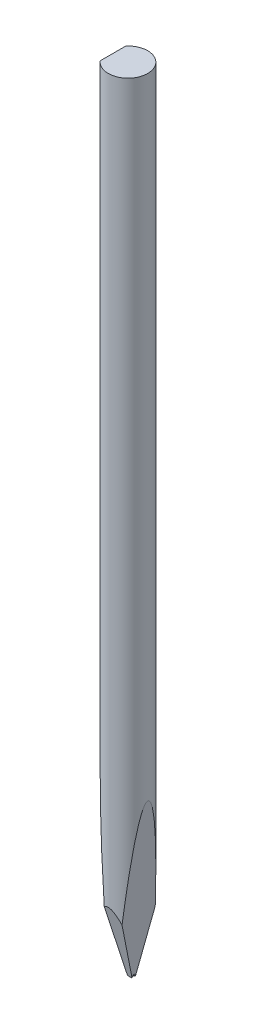
ISO-10303-21;
HEADER;
FILE_DESCRIPTION(('STEP AP214'),'2;1');
FILE_NAME('part.step','',(''),(''),'','','');
FILE_SCHEMA(('AUTOMOTIVE_DESIGN { 1 0 10303 214 1 1 1 1 }'));
ENDSEC;
DATA;
#1=APPLICATION_CONTEXT('core data for automotive mechanical design processes');
#2=APPLICATION_PROTOCOL_DEFINITION('international standard','automotive_design',2000,#1);
#3=PRODUCT_CONTEXT('',#1,'mechanical');
#4=PRODUCT('Part','Part','',(#3));
#5=PRODUCT_RELATED_PRODUCT_CATEGORY('part','',(#4));
#6=PRODUCT_DEFINITION_FORMATION('','',#4);
#7=PRODUCT_DEFINITION_CONTEXT('part definition',#1,'design');
#8=PRODUCT_DEFINITION('design','',#6,#7);
#9=PRODUCT_DEFINITION_SHAPE('','',#8);
#10=(LENGTH_UNIT() NAMED_UNIT(*) SI_UNIT(.MILLI.,.METRE.));
#11=(NAMED_UNIT(*) PLANE_ANGLE_UNIT() SI_UNIT($,.RADIAN.));
#12=(NAMED_UNIT(*) SI_UNIT($,.STERADIAN.) SOLID_ANGLE_UNIT());
#13=UNCERTAINTY_MEASURE_WITH_UNIT(LENGTH_MEASURE(1.E-05),#10,'distance_accuracy_value','');
#14=(GEOMETRIC_REPRESENTATION_CONTEXT(3) GLOBAL_UNCERTAINTY_ASSIGNED_CONTEXT((#13)) GLOBAL_UNIT_ASSIGNED_CONTEXT((#10,
#11,#12)) REPRESENTATION_CONTEXT('',''));
#15=CARTESIAN_POINT('',(0.,0.,0.));
#16=DIRECTION('',(0.,0.,1.));
#17=DIRECTION('',(1.,0.,0.));
#18=AXIS2_PLACEMENT_3D('',#15,#16,#17);
#19=CARTESIAN_POINT('',(-1.20777,0.0528579827698459,0.));
#20=DIRECTION('',(1.,0.,0.));
#21=DIRECTION('',(0.,0.,-1.));
#22=AXIS2_PLACEMENT_3D('',#19,#20,#21);
#23=CYLINDRICAL_SURFACE('',#22,0.02794);
#24=CARTESIAN_POINT('',(0.331594350892738,0.0528579827698459,0.));
#25=DIRECTION('',(-1.,0.,0.));
#26=DIRECTION('',(0.,1.,0.));
#27=AXIS2_PLACEMENT_3D('',#24,#25,#26);
#28=CIRCLE('',#27,0.0284220172301541);
#29=CARTESIAN_POINT('',(0.331594350892738,0.081038991384923,0.));
#30=VERTEX_POINT('',#29);
#31=CARTESIAN_POINT('',(0.331594350892738,0.0690219452640596,-0.023084530817166));
#32=VERTEX_POINT('',#31);
#33=EDGE_CURVE('E785',#30,#32,#28,.T.);
#34=ORIENTED_EDGE('',*,*,#33,.F.);
#35=CARTESIAN_POINT('',(0.331594350892738,0.0528579827698459,0.));
#36=DIRECTION('',(-1.,0.,0.));
#37=DIRECTION('',(0.,0.573576436351046,0.819152044288992));
#38=AXIS2_PLACEMENT_3D('',#35,#36,#37);
#39=CIRCLE('',#38,0.0284220172301541);
#40=CARTESIAN_POINT('',(0.331594350892738,0.0690219452640599,0.0230845308171661));
#41=VERTEX_POINT('',#40);
#42=EDGE_CURVE('E787',#41,#30,#39,.T.);
#43=ORIENTED_EDGE('',*,*,#42,.F.);
#44=CARTESIAN_POINT('',(0.141102121906106,0.0688837084014941,0.0228871081174345));
#45=DIRECTION('',(1.,0.,0.));
#46=VECTOR('',#45,1.);
#47=LINE('',#44,#46);
#48=CARTESIAN_POINT('',(0.141102121906106,0.0690219452640599,0.0230845308171661));
#49=VERTEX_POINT('',#48);
#50=EDGE_CURVE('E741',#49,#41,#47,.T.);
#51=ORIENTED_EDGE('',*,*,#50,.F.);
#52=CARTESIAN_POINT('',(0.141102121906106,0.0528579827698459,0.));
#53=DIRECTION('',(-1.,0.,0.));
#54=DIRECTION('',(0.,0.573576436351046,0.819152044288992));
#55=AXIS2_PLACEMENT_3D('',#52,#53,#54);
#56=CIRCLE('',#55,0.0284220172301541);
#57=CARTESIAN_POINT('',(0.141102121906106,0.081038991384923,0.));
#58=VERTEX_POINT('',#57);
#59=EDGE_CURVE('E819',#49,#58,#56,.T.);
#60=ORIENTED_EDGE('',*,*,#59,.T.);
#61=CARTESIAN_POINT('',(0.141102121906106,0.0528579827698459,0.));
#62=DIRECTION('',(-1.,0.,0.));
#63=DIRECTION('',(0.,1.,0.));
#64=AXIS2_PLACEMENT_3D('',#61,#62,#63);
#65=CIRCLE('',#64,0.028422017230154);
#66=CARTESIAN_POINT('',(0.141102121906106,0.0690219452640595,-0.023084530817166));
#67=VERTEX_POINT('',#66);
#68=EDGE_CURVE('E790',#58,#67,#65,.T.);
#69=ORIENTED_EDGE('',*,*,#68,.T.);
#70=CARTESIAN_POINT('',(0.141102121906106,0.0688837084014941,-0.0228871081174345));
#71=DIRECTION('',(1.,0.,0.));
#72=VECTOR('',#71,1.);
#73=LINE('',#70,#72);
#74=EDGE_CURVE('E559',#67,#32,#73,.T.);
#75=ORIENTED_EDGE('',*,*,#74,.T.);
#76=EDGE_LOOP('',(#34,#43,#51,#60,#69,#75));
#77=FACE_BOUND('',#76,.T.);
#78=ADVANCED_FACE('F409',(#77),#23,.F.);
#79=CARTESIAN_POINT('',(0.,0.,0.));
#80=DIRECTION('',(0.,1.,0.));
#81=DIRECTION('',(0.,0.,1.));
#82=AXIS2_PLACEMENT_3D('',#79,#80,#81);
#83=PLANE('',#82);
#84=CARTESIAN_POINT('',(0.141102121906106,0.,-0.14922762077227));
#85=DIRECTION('',(0.,1.,0.));
#86=DIRECTION('',(0.,0.,-1.));
#87=AXIS2_PLACEMENT_3D('',#84,#85,#86);
#88=ELLIPSE('',#87,0.0775191863863524,0.0635);
#89=CARTESIAN_POINT('',(0.0952500000000003,0.,-0.0955991595905925));
#90=VERTEX_POINT('',#89);
#91=CARTESIAN_POINT('',(0.141102121906106,-0.000241008615077043,-0.071582973242009));
#92=VERTEX_POINT('',#91);
#93=EDGE_CURVE('E891',#90,#92,#88,.T.);
#94=ORIENTED_EDGE('',*,*,#93,.F.);
#95=DIRECTION('',(0.,0.,-1.));
#96=VECTOR('',#95,1.);
#97=CARTESIAN_POINT('',(0.0952500000000003,0.,80.8360855398669));
#98=LINE('',#97,#96);
#99=CARTESIAN_POINT('',(0.0952500000000045,0.,-0.133349999999995));
#100=VERTEX_POINT('',#99);
#101=EDGE_CURVE('E707',#90,#100,#98,.T.);
#102=ORIENTED_EDGE('',*,*,#101,.T.);
#103=DIRECTION('',(-1.,0.,0.));
#104=VECTOR('',#103,1.);
#105=CARTESIAN_POINT('',(81.0604131023871,0.,-0.13335));
#106=LINE('',#105,#104);
#107=CARTESIAN_POINT('',(0.444911998918038,0.,-0.13335));
#108=VERTEX_POINT('',#107);
#109=EDGE_CURVE('E551',#108,#100,#106,.T.);
#110=ORIENTED_EDGE('',*,*,#109,.F.);
#111=CARTESIAN_POINT('',(0.331594350892738,0.,-0.257754481713163));
#112=DIRECTION('',(0.,1.,0.));
#113=DIRECTION('',(0.,0.,-1.));
#114=AXIS2_PLACEMENT_3D('',#111,#112,#113);
#115=ELLIPSE('',#114,0.186046047327246,0.1524);
#116=CARTESIAN_POINT('',(0.331594350892738,-0.000241008615077052,-0.071582973242009));
#117=VERTEX_POINT('',#116);
#118=EDGE_CURVE('E531',#117,#108,#115,.T.);
#119=ORIENTED_EDGE('',*,*,#118,.F.);
#120=CARTESIAN_POINT('',(0.141102121906106,0.,-0.07112));
#121=DIRECTION('',(1.,0.,0.));
#122=VECTOR('',#121,1.);
#123=LINE('',#120,#122);
#124=EDGE_CURVE('E548',#92,#117,#123,.T.);
#125=ORIENTED_EDGE('',*,*,#124,.F.);
#126=EDGE_LOOP('',(#94,#102,#110,#119,#125));
#127=FACE_BOUND('',#126,.T.);
#128=ADVANCED_FACE('F547',(#127),#83,.F.);
#129=CARTESIAN_POINT('',(0.141102121906106,0.,0.14922762077227));
#130=DIRECTION('',(0.,1.,0.));
#131=DIRECTION('',(0.,0.,-1.));
#132=AXIS2_PLACEMENT_3D('',#129,#130,#131);
#133=ELLIPSE('',#132,0.0775191863863523,0.0635);
#134=CARTESIAN_POINT('',(0.141102121906108,-0.0002410086150768,0.0715829732420075));
#135=VERTEX_POINT('',#134);
#136=CARTESIAN_POINT('',(0.0952500000000003,0.,0.0955991595906203));
#137=VERTEX_POINT('',#136);
#138=EDGE_CURVE('E892',#135,#137,#133,.T.);
#139=ORIENTED_EDGE('',*,*,#138,.F.);
#140=CARTESIAN_POINT('',(0.141102121906111,0.,0.071119999999997));
#141=DIRECTION('',(1.,0.,0.));
#142=VECTOR('',#141,1.);
#143=LINE('',#140,#142);
#144=CARTESIAN_POINT('',(0.331594350892738,-0.000241008615076803,0.0715829732420075));
#145=VERTEX_POINT('',#144);
#146=EDGE_CURVE('E560',#135,#145,#143,.T.);
#147=ORIENTED_EDGE('',*,*,#146,.T.);
#148=CARTESIAN_POINT('',(0.331594350892738,0.,0.257754481713163));
#149=DIRECTION('',(0.,1.,0.));
#150=DIRECTION('',(0.,0.,-1.));
#151=AXIS2_PLACEMENT_3D('',#148,#149,#150);
#152=ELLIPSE('',#151,0.186046047327246,0.1524);
#153=CARTESIAN_POINT('',(0.444911998918038,0.,0.13335));
#154=VERTEX_POINT('',#153);
#155=EDGE_CURVE('E893',#154,#145,#152,.T.);
#156=ORIENTED_EDGE('',*,*,#155,.F.);
#157=DIRECTION('',(-1.,0.,0.));
#158=VECTOR('',#157,1.);
#159=CARTESIAN_POINT('',(81.0604131023871,0.,0.13335));
#160=LINE('',#159,#158);
#161=CARTESIAN_POINT('',(0.0952500000000043,0.,0.133350000000003));
#162=VERTEX_POINT('',#161);
#163=EDGE_CURVE('E906',#154,#162,#160,.T.);
#164=ORIENTED_EDGE('',*,*,#163,.T.);
#165=EDGE_CURVE('E710',#162,#137,#98,.T.);
#166=ORIENTED_EDGE('',*,*,#165,.T.);
#167=EDGE_LOOP('',(#139,#147,#156,#164,#166));
#168=FACE_BOUND('',#167,.T.);
#169=ADVANCED_FACE('F763',(#168),#83,.F.);
#170=CARTESIAN_POINT('',(81.0604131023871,0.,0.13335));
#171=DIRECTION('',(0.,-0.258819045102522,0.965925826289068));
#172=DIRECTION('',(0.,-0.965925826289068,-0.258819045102522));
#173=AXIS2_PLACEMENT_3D('',#170,#171,#172);
#174=PLANE('',#173);
#175=ORIENTED_EDGE('',*,*,#163,.F.);
#176=CARTESIAN_POINT('',(0.331594350892738,0.128496221506221,0.167780458783043));
#177=DIRECTION('',(0.,-0.258819045102522,0.965925826289068));
#178=DIRECTION('',(0.,0.965925826289068,0.258819045102522));
#179=AXIS2_PLACEMENT_3D('',#176,#177,#178);
#180=ELLIPSE('',#179,0.198944070894239,0.1524);
#181=CARTESIAN_POINT('',(0.467097739269662,0.040550845408876,0.144215566279708));
#182=VERTEX_POINT('',#181);
#183=EDGE_CURVE('E552',#154,#182,#180,.T.);
#184=ORIENTED_EDGE('',*,*,#183,.T.);
#185=DIRECTION('',(0.0842074097641779,0.962495097884607,0.257899784197096));
#186=VECTOR('',#185,1.);
#187=CARTESIAN_POINT('',(1.03505331806168,6.53231281664674,1.88367794392797));
#188=LINE('',#187,#186);
#189=CARTESIAN_POINT('',(0.856037795649059,4.48615603246423,1.3354118860188));
#190=VERTEX_POINT('',#189);
#191=EDGE_CURVE('E903',#182,#190,#188,.T.);
#192=ORIENTED_EDGE('',*,*,#191,.T.);
#193=CARTESIAN_POINT('',(0.,-0.497668975189311,0.));
#194=DIRECTION('',(0.,-0.258819045102522,0.965925826289068));
#195=DIRECTION('',(0.,-0.965925826289068,-0.258819045102522));
#196=AXIS2_PLACEMENT_3D('',#193,#194,#195);
#197=ELLIPSE('',#196,6.12872209373802,1.58623);
#198=CARTESIAN_POINT('',(-0.365218019910243,5.26317355132302,1.54361310270185));
#199=VERTEX_POINT('',#198);
#200=EDGE_CURVE('E920',#190,#199,#197,.T.);
#201=ORIENTED_EDGE('',*,*,#200,.T.);
#202=DIRECTION('',(0.0842074097641778,-0.962495097884607,-0.257899784197096));
#203=VECTOR('',#202,1.);
#204=CARTESIAN_POINT('',(0.669364892060237,-6.56216324404258,-1.62497634184241));
#205=LINE('',#204,#203);
#206=EDGE_CURVE('E915',#199,#162,#205,.T.);
#207=ORIENTED_EDGE('',*,*,#206,.T.);
#208=EDGE_LOOP('',(#175,#184,#192,#201,#207));
#209=FACE_BOUND('',#208,.T.);
#210=ADVANCED_FACE('F773',(#209),#174,.T.);
#211=CARTESIAN_POINT('',(81.0604131023871,0.,-0.13335));
#212=DIRECTION('',(0.,-0.258819045102522,-0.965925826289068));
#213=DIRECTION('',(0.,0.965925826289068,-0.258819045102522));
#214=AXIS2_PLACEMENT_3D('',#211,#212,#213);
#215=PLANE('',#214);
#216=DIRECTION('',(-0.0842074097641779,-0.962495097884607,0.257899784197096));
#217=VECTOR('',#216,1.);
#218=CARTESIAN_POINT('',(1.03505331806168,6.53231281664674,-1.88367794392797));
#219=LINE('',#218,#217);
#220=CARTESIAN_POINT('',(0.856037795649053,4.48615603246424,-1.33541188601881));
#221=VERTEX_POINT('',#220);
#222=CARTESIAN_POINT('',(0.467097739269663,0.0405508454088778,-0.144215566279708));
#223=VERTEX_POINT('',#222);
#224=EDGE_CURVE('E573',#221,#223,#219,.T.);
#225=ORIENTED_EDGE('',*,*,#224,.T.);
#226=CARTESIAN_POINT('',(0.331594350892738,0.128496221506221,-0.167780458783043));
#227=DIRECTION('',(0.,-0.258819045102522,-0.965925826289068));
#228=DIRECTION('',(0.,-0.965925826289068,0.258819045102522));
#229=AXIS2_PLACEMENT_3D('',#226,#227,#228);
#230=ELLIPSE('',#229,0.198944070894239,0.1524);
#231=EDGE_CURVE('E553',#223,#108,#230,.T.);
#232=ORIENTED_EDGE('',*,*,#231,.T.);
#233=ORIENTED_EDGE('',*,*,#109,.T.);
#234=DIRECTION('',(-0.0842074097641778,0.962495097884607,-0.257899784197096));
#235=VECTOR('',#234,1.);
#236=CARTESIAN_POINT('',(0.669364892060237,-6.56216324404258,1.62497634184241));
#237=LINE('',#236,#235);
#238=CARTESIAN_POINT('',(-0.365218019910235,5.26317355132303,-1.54361310270185));
#239=VERTEX_POINT('',#238);
#240=EDGE_CURVE('E890',#100,#239,#237,.T.);
#241=ORIENTED_EDGE('',*,*,#240,.T.);
#242=CARTESIAN_POINT('',(0.,-0.497668975189311,0.));
#243=DIRECTION('',(0.,-0.258819045102522,-0.965925826289068));
#244=DIRECTION('',(0.,-0.965925826289068,0.258819045102522));
#245=AXIS2_PLACEMENT_3D('',#242,#243,#244);
#246=ELLIPSE('',#245,6.12872209373802,1.58623);
#247=EDGE_CURVE('E922',#239,#221,#246,.T.);
#248=ORIENTED_EDGE('',*,*,#247,.T.);
#249=EDGE_LOOP('',(#225,#232,#233,#241,#248));
#250=FACE_BOUND('',#249,.T.);
#251=ADVANCED_FACE('F695',(#250),#215,.T.);
#252=CARTESIAN_POINT('',(0.0952500000000003,0.,80.8360855398669));
#253=DIRECTION('',(-0.996194698091745,-0.0871557427476583,0.));
#254=DIRECTION('',(0.0871557427476583,-0.996194698091746,0.));
#255=AXIS2_PLACEMENT_3D('',#252,#253,#254);
#256=PLANE('',#255);
#257=CARTESIAN_POINT('',(0.0853680982809139,0.112950653499904,-0.0130450000003961));
#258=CARTESIAN_POINT('',(0.085306802730967,0.113651264841724,-0.010357214784414));
#259=CARTESIAN_POINT('',(0.085264709906803,0.11413238802349,-0.00761252451787182));
#260=CARTESIAN_POINT('',(0.0852193471342383,0.114650886886502,-0.00208345316103922));
#261=CARTESIAN_POINT('',(0.0852160452819909,0.114688627230386,0.000700893426169584));
#262=CARTESIAN_POINT('',(0.0852493428569628,0.114308034206902,0.00636973147461618));
#263=CARTESIAN_POINT('',(0.0852878213215511,0.113868223344128,0.00925279363342999));
#264=CARTESIAN_POINT('',(0.0854061785101584,0.112515394487938,0.0149040524136027));
#265=CARTESIAN_POINT('',(0.085486054899822,0.111602403176328,0.0176722555021557));
#266=CARTESIAN_POINT('',(0.0856849895254451,0.109328570000625,0.0230348742293253));
#267=CARTESIAN_POINT('',(0.0858042672858596,0.107965218960532,0.0256282158665421));
#268=CARTESIAN_POINT('',(0.0860779870815729,0.104836587379228,0.0305581940887367));
#269=CARTESIAN_POINT('',(0.0862324397587098,0.103071185201251,0.0328947526686122));
#270=CARTESIAN_POINT('',(0.0865771749828692,0.0991308435585054,0.0373231271246905));
#271=CARTESIAN_POINT('',(0.0867684271174483,0.0969448216572513,0.0394050019926743));
#272=CARTESIAN_POINT('',(0.0871777649309649,0.0922660690392582,0.043186065462563));
#273=CARTESIAN_POINT('',(0.0873958540875975,0.0897732985722824,0.0448852043864293));
#274=CARTESIAN_POINT('',(0.0878610195252131,0.0844564332909002,0.0479145163021059));
#275=CARTESIAN_POINT('',(0.0881088505893304,0.0816237112657902,0.0492294283580893));
#276=CARTESIAN_POINT('',(0.0886199597072271,0.0757817073158118,0.0513740814121499));
#277=CARTESIAN_POINT('',(0.0888832341259697,0.0727724669396057,0.0522039360821871));
#278=CARTESIAN_POINT('',(0.0893465110871542,0.0674771870426021,0.0532035136177015));
#279=CARTESIAN_POINT('',(0.0895446576930745,0.065212360973319,0.0534902786271572));
#280=CARTESIAN_POINT('',(0.0899422533359651,0.0606678219797293,0.053788144086283));
#281=CARTESIAN_POINT('',(0.0901417003062279,0.0583881326779973,0.0537996082519708));
#282=CARTESIAN_POINT('',(0.0903405577126821,0.0561151821214351,0.0536720792167106));
#283=B_SPLINE_CURVE_WITH_KNOTS('',3,(#257,#258,#259,#260,#261,#262,#263,#264,#265,#266,#267,
#268,#269,#270,#271,#272,#273,#274,#275,#276,#277,#278,#279,#280,#281,#282),.UNSPECIFIED.,.F.,
.F.,(4,2,2,2,2,2,2,2,2,2,2,2,4),(0.,0.00832479897356052,0.0166427506909291,0.025350898033152,
0.034058554391816,0.0428155675386442,0.0515752335647377,0.0606088857611473,0.0696437098251714,
0.078999663239234,0.0883534232295314,0.0952120350022421,0.102061584963279),.UNSPECIFIED.);
#284=CARTESIAN_POINT('',(0.0852221219067103,0.114619171092019,5.48915438786733E-13));
#285=VERTEX_POINT('',#284);
#286=CARTESIAN_POINT('',(0.0877399893223402,0.0858398148400881,0.0471029377298195));
#287=VERTEX_POINT('',#286);
#288=EDGE_CURVE('E419',#285,#287,#283,.T.);
#289=ORIENTED_EDGE('',*,*,#288,.T.);
#290=CARTESIAN_POINT('',(0.141102121906106,-0.524092151579379,0.516200896024695));
#291=DIRECTION('',(-0.996194698091745,-0.0871557427476583,0.));
#292=DIRECTION('',(-0.0713040831581058,0.815009399897592,-0.575043829463067));
#293=AXIS2_PLACEMENT_3D('',#290,#291,#292);
#294=ELLIPSE('',#293,0.88943291563464,0.0635);
#295=EDGE_CURVE('E49',#287,#137,#294,.T.);
#296=ORIENTED_EDGE('',*,*,#295,.T.);
#297=ORIENTED_EDGE('',*,*,#165,.F.);
#298=ORIENTED_EDGE('',*,*,#206,.F.);
#299=CARTESIAN_POINT('',(0.,1.08871248183801,0.));
#300=DIRECTION('',(-0.996194698091745,-0.0871557427476583,0.));
#301=DIRECTION('',(0.0871557427476583,-0.996194698091746,0.));
#302=AXIS2_PLACEMENT_3D('',#299,#300,#301);
#303=ELLIPSE('',#302,18.1999481616789,1.58623);
#304=CARTESIAN_POINT('',(-1.20777,14.8935867515441,1.02830794998386));
#305=VERTEX_POINT('',#304);
#306=EDGE_CURVE('E941',#199,#305,#303,.T.);
#307=ORIENTED_EDGE('',*,*,#306,.T.);
#308=DIRECTION('',(0.,0.,1.));
#309=VECTOR('',#308,1.);
#310=CARTESIAN_POINT('',(-1.20777,14.8935867515441,1.59623));
#311=LINE('',#310,#309);
#312=CARTESIAN_POINT('',(-1.20777,14.8935867515441,-1.02830794998386));
#313=VERTEX_POINT('',#312);
#314=EDGE_CURVE('E943',#313,#305,#311,.T.);
#315=ORIENTED_EDGE('',*,*,#314,.F.);
#316=EDGE_CURVE('E716',#313,#239,#303,.T.);
#317=ORIENTED_EDGE('',*,*,#316,.T.);
#318=ORIENTED_EDGE('',*,*,#240,.F.);
#319=ORIENTED_EDGE('',*,*,#101,.F.);
#320=CARTESIAN_POINT('',(0.141102121906106,-0.524092151579379,-0.516200896024695));
#321=DIRECTION('',(-0.996194698091745,-0.0871557427476583,0.));
#322=DIRECTION('',(0.0713040831581058,-0.815009399897592,-0.575043829463068));
#323=AXIS2_PLACEMENT_3D('',#320,#321,#322);
#324=ELLIPSE('',#323,0.88943291563464,0.0635);
#325=CARTESIAN_POINT('',(0.0877399893223272,0.0858398148400996,-0.0471029377298361));
#326=VERTEX_POINT('',#325);
#327=EDGE_CURVE('E689',#90,#326,#324,.T.);
#328=ORIENTED_EDGE('',*,*,#327,.T.);
#329=CARTESIAN_POINT('',(0.0903405577130435,0.0561151821173046,-0.0536720792164797));
#330=CARTESIAN_POINT('',(0.0900625588999809,0.0592927230907149,-0.053852072228692));
#331=CARTESIAN_POINT('',(0.0897833101699781,0.0624845506801266,-0.0537576509357613));
#332=CARTESIAN_POINT('',(0.0892301888232625,0.0688067566028605,-0.0530350641523713));
#333=CARTESIAN_POINT('',(0.0889563144881266,0.0719371545778478,-0.0524070722088197));
#334=CARTESIAN_POINT('',(0.0884214545400756,0.078050631758722,-0.0506319537506382));
#335=CARTESIAN_POINT('',(0.0881604773546435,0.0810336146380393,-0.0494844926430063));
#336=CARTESIAN_POINT('',(0.0876591696698671,0.0867635876948096,-0.0467011384868344));
#337=CARTESIAN_POINT('',(0.0874188344639484,0.0895106316686553,-0.0450653571628562));
#338=CARTESIAN_POINT('',(0.0869671653231595,0.0946732335714155,-0.0413568566453099));
#339=CARTESIAN_POINT('',(0.0867556864515055,0.0970904481353496,-0.0392864645348245));
#340=CARTESIAN_POINT('',(0.0863669840227873,0.101533337225809,-0.0347575738077288));
#341=CARTESIAN_POINT('',(0.086189760798802,0.103559007945224,-0.0322990714178172));
#342=CARTESIAN_POINT('',(0.0858798890254995,0.107100858521221,-0.0271313679753356));
#343=CARTESIAN_POINT('',(0.0857461907782302,0.108629036480298,-0.0244304604692065));
#344=CARTESIAN_POINT('',(0.0855219861385629,0.111191707238216,-0.0188017469580206));
#345=CARTESIAN_POINT('',(0.0854314719174977,0.112226289519136,-0.015873982191004));
#346=CARTESIAN_POINT('',(0.0852996580270156,0.113732929181576,-0.00999220773693177));
#347=CARTESIAN_POINT('',(0.0852566592818415,0.114224407087869,-0.00704318894919974));
#348=CARTESIAN_POINT('',(0.085215688465718,0.114692705659048,-0.00110548969918523));
#349=CARTESIAN_POINT('',(0.0852176685475672,0.114670073219947,0.00188314523728298));
#350=CARTESIAN_POINT('',(0.0852533777820124,0.114261914802548,0.00622930478701443));
#351=CARTESIAN_POINT('',(0.0852696472766882,0.114075953627463,0.00760832458486332));
#352=CARTESIAN_POINT('',(0.08531175543705,0.113594655152155,0.0103443328597831));
#353=CARTESIAN_POINT('',(0.08533757607586,0.113299523900066,0.0117013578455679));
#354=CARTESIAN_POINT('',(0.0853680982809139,0.112950653499904,0.0130450000003961));
#355=B_SPLINE_CURVE_WITH_KNOTS('',3,(#329,#330,#331,#332,#333,#334,#335,#336,#337,#338,#339,
#340,#341,#342,#343,#344,#345,#346,#347,#348,#349,#350,#351,#352,#353,#354),.UNSPECIFIED.,.F.,
.F.,(4,2,2,2,2,2,2,2,2,2,2,2,4),(0.,0.0095713661754159,0.0191396204004347,0.0287140463795143,
0.0382862834674833,0.0478085177422229,0.057330844600115,0.0666027430295172,0.0758729599525209,
0.0847997315385886,0.0937170075231793,0.0978879902754805,0.102051140531945),.UNSPECIFIED.);
#356=EDGE_CURVE('E699',#326,#285,#355,.T.);
#357=ORIENTED_EDGE('',*,*,#356,.T.);
#358=EDGE_LOOP('',(#289,#296,#297,#298,#307,#315,#317,#318,#319,#328,#357));
#359=FACE_BOUND('',#358,.T.);
#360=ADVANCED_FACE('F692',(#359),#256,.T.);
#361=CARTESIAN_POINT('',(0.46355,0.,80.8360855398669));
#362=DIRECTION('',(0.996194698091745,-0.0871557427476584,0.));
#363=DIRECTION('',(0.0871557427476584,0.996194698091746,0.));
#364=AXIS2_PLACEMENT_3D('',#361,#362,#363);
#365=PLANE('',#364);
#366=CARTESIAN_POINT('',(0.483994350892738,0.23368,1.72835566035269E-11));
#367=VERTEX_POINT('',#366);
#368=VERTEX_LOOP('',#367);
#369=FACE_BOUND('',#368,.T.);
#370=ORIENTED_EDGE('',*,*,#191,.F.);
#371=CARTESIAN_POINT('',(0.331594350892738,-1.50825997094083,1.31384948294588));
#372=DIRECTION('',(0.996194698091745,-0.0871557427476584,0.));
#373=DIRECTION('',(0.0713040831581058,0.815009399897592,-0.575043829463067));
#374=AXIS2_PLACEMENT_3D('',#371,#372,#373);
#375=ELLIPSE('',#374,2.13463899752313,0.1524);
#376=CARTESIAN_POINT('',(0.474605606715804,0.126366163000392,0.104980561075495));
#377=VERTEX_POINT('',#376);
#378=EDGE_CURVE('E706',#182,#377,#375,.T.);
#379=ORIENTED_EDGE('',*,*,#378,.T.);
#380=CARTESIAN_POINT('',(0.469123918687252,0.0637101821266247,0.114648463830072));
#381=CARTESIAN_POINT('',(0.469769903952762,0.0710938274982212,0.115313604623831));
#382=CARTESIAN_POINT('',(0.470420209169954,0.0785268501434823,0.115330309599867));
#383=CARTESIAN_POINT('',(0.471710717548722,0.0932774284099497,0.114127188446851));
#384=CARTESIAN_POINT('',(0.472350939964625,0.100595204109123,0.112910112945749));
#385=CARTESIAN_POINT('',(0.47361042117263,0.114991140190969,0.10928824564559));
#386=CARTESIAN_POINT('',(0.474229479487037,0.122067009103099,0.10687433894372));
#387=CARTESIAN_POINT('',(0.475426290961142,0.135746626848661,0.100943323233606));
#388=CARTESIAN_POINT('',(0.476004023570742,0.142350140793403,0.0974256699827568));
#389=CARTESIAN_POINT('',(0.47713073766355,0.155228541804454,0.0891940215700963));
#390=CARTESIAN_POINT('',(0.477676952219606,0.1614718027487,0.0844301420514504));
#391=CARTESIAN_POINT('',(0.478693356844815,0.173089360775609,0.0739246298093389));
#392=CARTESIAN_POINT('',(0.479163518133213,0.178463328892736,0.068182628616119));
#393=CARTESIAN_POINT('',(0.479930600551335,0.187231121052402,0.0570082236666923));
#394=CARTESIAN_POINT('',(0.480243475538906,0.190807298524561,0.0517193700482092));
#395=CARTESIAN_POINT('',(0.480793662408736,0.197095963223007,0.0406447751823569));
#396=CARTESIAN_POINT('',(0.481031084880005,0.199809714487466,0.0348597770746292));
#397=CARTESIAN_POINT('',(0.481359000812426,0.20355781074594,0.024416532106168));
#398=CARTESIAN_POINT('',(0.48147157001001,0.204844482562006,0.0198505441559759));
#399=CARTESIAN_POINT('',(0.481627884371795,0.206631163892889,0.0105734569992826));
#400=CARTESIAN_POINT('',(0.481671877609633,0.207134008902344,0.00586294399330976));
#401=CARTESIAN_POINT('',(0.481681313466849,0.20724186124384,-0.00105211846684362));
#402=CARTESIAN_POINT('',(0.481676117641798,0.207182472691753,-0.00325477115603657));
#403=CARTESIAN_POINT('',(0.481662359965692,0.207025221734295,-0.00545000000491152));
#404=B_SPLINE_CURVE_WITH_KNOTS('',3,(#380,#381,#382,#383,#384,#385,#386,#387,#388,#389,#390,
#391,#392,#393,#394,#395,#396,#397,#398,#399,#400,#401,#402,#403),.UNSPECIFIED.,.F.,.F.,(4,2,2,
2,2,2,2,2,2,2,2,4),(0.,0.0222851128483897,0.0445206516130811,0.0669281962547242,
0.0893468071649199,0.112856293068963,0.136374654933413,0.155486738749651,0.174570679835322,
0.188752729423314,0.202883355371406,0.209485896108139),.UNSPECIFIED.);
#405=CARTESIAN_POINT('',(0.481679052451791,0.207216017723515,0.));
#406=VERTEX_POINT('',#405);
#407=EDGE_CURVE('E982',#377,#406,#404,.T.);
#408=ORIENTED_EDGE('',*,*,#407,.T.);
#409=CARTESIAN_POINT('',(0.481662359994532,0.207025222063943,0.00544999999999999));
#410=CARTESIAN_POINT('',(0.481694235594991,0.207389561844372,0.000573838724107298));
#411=CARTESIAN_POINT('',(0.481682133558031,0.207251234928945,-0.00431395835513871));
#412=CARTESIAN_POINT('',(0.481582531888413,0.206112782635763,-0.0139362569972043));
#413=CARTESIAN_POINT('',(0.481495865959926,0.205122186540301,-0.0186718551138498));
#414=CARTESIAN_POINT('',(0.481228195202036,0.202062695777691,-0.0291679984087638));
#415=CARTESIAN_POINT('',(0.481028114664391,0.199775764767643,-0.0348625433262001));
#416=CARTESIAN_POINT('',(0.480551584092007,0.194328995401431,-0.0458407154885464));
#417=CARTESIAN_POINT('',(0.480274701593138,0.191164213957643,-0.0511217919724119));
#418=CARTESIAN_POINT('',(0.479579556765113,0.183218672215323,-0.062487721762609));
#419=CARTESIAN_POINT('',(0.479143249427735,0.178231656529008,-0.0684277179081019));
#420=CARTESIAN_POINT('',(0.478192192226804,0.167361022979451,-0.0793911278650442));
#421=CARTESIAN_POINT('',(0.477677539708274,0.161478517774908,-0.0844156623618305));
#422=CARTESIAN_POINT('',(0.476580985029406,0.14894484044261,-0.0934621096814356));
#423=CARTESIAN_POINT('',(0.475998748584026,0.14228984741934,-0.0974786985106697));
#424=CARTESIAN_POINT('',(0.474784590141802,0.128411952920886,-0.10435607358993));
#425=CARTESIAN_POINT('',(0.474152671556043,0.12118909043457,-0.107216939107145));
#426=CARTESIAN_POINT('',(0.47279809754335,0.105706238621528,-0.111873368705051));
#427=CARTESIAN_POINT('',(0.472072357052496,0.0974109868528302,-0.113552560856355));
#428=CARTESIAN_POINT('',(0.470603917563986,0.0806266466957223,-0.115323932706838));
#429=CARTESIAN_POINT('',(0.469861168180126,0.0721369823903538,-0.115410547819804));
#430=CARTESIAN_POINT('',(0.46912391868577,0.0637101821096838,-0.114648463773331));
#431=B_SPLINE_CURVE_WITH_KNOTS('',3,(#409,#410,#411,#412,#413,#414,#415,#416,#417,#418,#419,
#420,#421,#422,#423,#424,#425,#426,#427,#428,#429,#430),.UNSPECIFIED.,.F.,.F.,(4,2,2,2,2,2,2,2,
2,2,4),(0.,0.0146059465179629,0.0290506743298542,0.0473718946289701,0.065798450735824,
0.0889857844226804,0.112144539186074,0.135423159527417,0.158700182995038,0.184032567024207,
0.209453447588983),.UNSPECIFIED.);
#432=CARTESIAN_POINT('',(0.474605606717621,0.126366163021166,-0.104980561066973));
#433=VERTEX_POINT('',#432);
#434=EDGE_CURVE('E614',#406,#433,#431,.T.);
#435=ORIENTED_EDGE('',*,*,#434,.T.);
#436=CARTESIAN_POINT('',(0.331594350892738,-1.50825997094083,-1.31384948294588));
#437=DIRECTION('',(0.996194698091745,-0.0871557427476584,0.));
#438=DIRECTION('',(-0.0713040831581058,-0.815009399897592,-0.575043829463068));
#439=AXIS2_PLACEMENT_3D('',#436,#437,#438);
#440=ELLIPSE('',#439,2.13463899752313,0.1524);
#441=EDGE_CURVE('E628',#433,#223,#440,.T.);
#442=ORIENTED_EDGE('',*,*,#441,.T.);
#443=ORIENTED_EDGE('',*,*,#224,.F.);
#444=CARTESIAN_POINT('',(0.,-5.29840074494502,0.));
#445=DIRECTION('',(0.996194698091745,-0.0871557427476584,0.));
#446=DIRECTION('',(-0.0871557427476584,-0.996194698091746,0.));
#447=AXIS2_PLACEMENT_3D('',#444,#445,#446);
#448=ELLIPSE('',#447,18.1999481616789,1.58623);
#449=EDGE_CURVE('E911',#221,#190,#448,.T.);
#450=ORIENTED_EDGE('',*,*,#449,.T.);
#451=EDGE_LOOP('',(#370,#379,#408,#435,#442,#443,#450));
#452=FACE_BOUND('',#451,.T.);
#453=ADVANCED_FACE('F587',(#369,#452),#365,.T.);
#454=CARTESIAN_POINT('',(-1.20777,0.0688837084014941,-0.0228871081174345));
#455=DIRECTION('',(0.,0.573576436351044,-0.819152044288993));
#456=DIRECTION('',(0.,0.819152044288993,0.573576436351044));
#457=AXIS2_PLACEMENT_3D('',#454,#455,#456);
#458=PLANE('',#457);
#459=ORIENTED_EDGE('',*,*,#74,.F.);
#460=DIRECTION('',(0.,-0.819152044288993,-0.573576436351044));
#461=VECTOR('',#460,1.);
#462=CARTESIAN_POINT('',(0.141102121906106,0.0691601821266257,-0.0232819535168977));
#463=LINE('',#462,#461);
#464=EDGE_CURVE('E538',#67,#92,#463,.T.);
#465=ORIENTED_EDGE('',*,*,#464,.T.);
#466=ORIENTED_EDGE('',*,*,#124,.T.);
#467=DIRECTION('',(0.,-0.819152044288993,-0.573576436351044));
#468=VECTOR('',#467,1.);
#469=CARTESIAN_POINT('',(0.331594350892738,0.0691601821266257,-0.0232819535168977));
#470=LINE('',#469,#468);
#471=EDGE_CURVE('E527',#32,#117,#470,.T.);
#472=ORIENTED_EDGE('',*,*,#471,.F.);
#473=EDGE_LOOP('',(#459,#465,#466,#472));
#474=FACE_BOUND('',#473,.T.);
#475=ADVANCED_FACE('F557',(#474),#458,.F.);
#476=CARTESIAN_POINT('',(-1.20777,0.,0.07112));
#477=DIRECTION('',(0.,0.573576436351044,0.819152044288993));
#478=DIRECTION('',(0.,-0.819152044288993,0.573576436351044));
#479=AXIS2_PLACEMENT_3D('',#476,#477,#478);
#480=PLANE('',#479);
#481=ORIENTED_EDGE('',*,*,#146,.F.);
#482=DIRECTION('',(0.,0.819152044288993,-0.573576436351044));
#483=VECTOR('',#482,1.);
#484=CARTESIAN_POINT('',(0.141102121906106,-0.346267424544471,0.314167495288417));
#485=LINE('',#484,#483);
#486=EDGE_CURVE('E413',#135,#49,#485,.T.);
#487=ORIENTED_EDGE('',*,*,#486,.T.);
#488=ORIENTED_EDGE('',*,*,#50,.T.);
#489=DIRECTION('',(0.,0.819152044288993,-0.573576436351044));
#490=VECTOR('',#489,1.);
#491=CARTESIAN_POINT('',(0.331594350892738,-0.346267424544471,0.314167495288417));
#492=LINE('',#491,#490);
#493=EDGE_CURVE('E823',#145,#41,#492,.T.);
#494=ORIENTED_EDGE('',*,*,#493,.F.);
#495=EDGE_LOOP('',(#481,#487,#488,#494));
#496=FACE_BOUND('',#495,.T.);
#497=ADVANCED_FACE('F586',(#496),#480,.F.);
#498=CARTESIAN_POINT('',(0.,63.5,0.));
#499=DIRECTION('',(0.,-1.,0.));
#500=DIRECTION('',(0.,0.,-1.));
#501=AXIS2_PLACEMENT_3D('',#498,#499,#500);
#502=CYLINDRICAL_SURFACE('',#501,1.58623);
#503=ORIENTED_EDGE('',*,*,#449,.F.);
#504=ORIENTED_EDGE('',*,*,#247,.F.);
#505=ORIENTED_EDGE('',*,*,#316,.F.);
#506=DIRECTION('',(0.,-1.,0.));
#507=VECTOR('',#506,1.);
#508=CARTESIAN_POINT('',(-1.20777,63.5,-1.02830794998386));
#509=LINE('',#508,#507);
#510=CARTESIAN_POINT('',(-1.20777,63.5,-1.02830794998385));
#511=VERTEX_POINT('',#510);
#512=EDGE_CURVE('E929',#511,#313,#509,.T.);
#513=ORIENTED_EDGE('',*,*,#512,.F.);
#514=CARTESIAN_POINT('',(0.,63.5,0.));
#515=DIRECTION('',(0.,1.,0.));
#516=DIRECTION('',(0.,0.,1.));
#517=AXIS2_PLACEMENT_3D('',#514,#515,#516);
#518=CIRCLE('',#517,1.58623);
#519=CARTESIAN_POINT('',(-1.20777,63.5,1.02830794998386));
#520=VERTEX_POINT('',#519);
#521=EDGE_CURVE('E932',#520,#511,#518,.T.);
#522=ORIENTED_EDGE('',*,*,#521,.F.);
#523=DIRECTION('',(0.,-1.,0.));
#524=VECTOR('',#523,1.);
#525=CARTESIAN_POINT('',(-1.20777,63.5,1.02830794998386));
#526=LINE('',#525,#524);
#527=EDGE_CURVE('E927',#305,#520,#526,.F.);
#528=ORIENTED_EDGE('',*,*,#527,.F.);
#529=ORIENTED_EDGE('',*,*,#306,.F.);
#530=ORIENTED_EDGE('',*,*,#200,.F.);
#531=EDGE_LOOP('',(#503,#504,#505,#513,#522,#528,#529,#530));
#532=FACE_BOUND('',#531,.T.);
#533=ADVANCED_FACE('F411',(#532),#502,.T.);
#534=CARTESIAN_POINT('',(-1.20777,63.5,1.59623));
#535=DIRECTION('',(-1.,0.,0.));
#536=DIRECTION('',(0.,0.,1.));
#537=AXIS2_PLACEMENT_3D('',#534,#535,#536);
#538=PLANE('',#537);
#539=ORIENTED_EDGE('',*,*,#512,.T.);
#540=ORIENTED_EDGE('',*,*,#314,.T.);
#541=ORIENTED_EDGE('',*,*,#527,.T.);
#542=DIRECTION('',(0.,0.,-1.));
#543=VECTOR('',#542,1.);
#544=CARTESIAN_POINT('',(-1.20777,63.5,1.59623));
#545=LINE('',#544,#543);
#546=EDGE_CURVE('E925',#520,#511,#545,.T.);
#547=ORIENTED_EDGE('',*,*,#546,.T.);
#548=EDGE_LOOP('',(#539,#540,#541,#547));
#549=FACE_BOUND('',#548,.T.);
#550=ADVANCED_FACE('F767',(#549),#538,.T.);
#551=CARTESIAN_POINT('',(0.,63.5,0.));
#552=DIRECTION('',(0.,1.,0.));
#553=DIRECTION('',(0.,0.,1.));
#554=AXIS2_PLACEMENT_3D('',#551,#552,#553);
#555=PLANE('',#554);
#556=ORIENTED_EDGE('',*,*,#521,.T.);
#557=ORIENTED_EDGE('',*,*,#546,.F.);
#558=EDGE_LOOP('',(#556,#557));
#559=FACE_BOUND('',#558,.T.);
#560=ADVANCED_FACE('F637',(#559),#555,.T.);
#561=CARTESIAN_POINT('',(0.331594350892738,0.052857982769846,0.));
#562=DIRECTION('',(-1.,0.,0.));
#563=DIRECTION('',(0.,0.,1.));
#564=AXIS2_PLACEMENT_3D('',#561,#562,#563);
#565=TOROIDAL_SURFACE('',#564,0.180822017230154,0.1524);
#566=ORIENTED_EDGE('',*,*,#434,.F.);
#567=CARTESIAN_POINT('',(0.331594350892738,0.23368,0.));
#568=DIRECTION('',(0.,0.,-1.));
#569=DIRECTION('',(-1.,0.,0.));
#570=AXIS2_PLACEMENT_3D('',#567,#568,#569);
#571=CIRCLE('',#570,0.1524);
#572=EDGE_CURVE('E847',#406,#30,#571,.T.);
#573=ORIENTED_EDGE('',*,*,#572,.T.);
#574=ORIENTED_EDGE('',*,*,#33,.T.);
#575=CARTESIAN_POINT('',(0.331594350892738,0.156573231026525,-0.14812072506654));
#576=DIRECTION('',(0.,-0.819152044288993,-0.573576436351045));
#577=DIRECTION('',(-1.,0.,0.));
#578=AXIS2_PLACEMENT_3D('',#575,#576,#577);
#579=CIRCLE('',#578,0.1524);
#580=EDGE_CURVE('E435',#433,#32,#579,.T.);
#581=ORIENTED_EDGE('',*,*,#580,.F.);
#582=EDGE_LOOP('',(#566,#573,#574,#581));
#583=FACE_BOUND('',#582,.T.);
#584=ADVANCED_FACE('F633',(#583),#565,.T.);
#585=CARTESIAN_POINT('',(0.331594350892738,0.156573231026525,-0.14812072506654));
#586=DIRECTION('',(0.,-0.819152044288993,-0.573576436351044));
#587=DIRECTION('',(0.,0.573576436351044,-0.819152044288993));
#588=AXIS2_PLACEMENT_3D('',#585,#586,#587);
#589=CYLINDRICAL_SURFACE('',#588,0.1524);
#590=ORIENTED_EDGE('',*,*,#471,.T.);
#591=ORIENTED_EDGE('',*,*,#118,.T.);
#592=ORIENTED_EDGE('',*,*,#231,.F.);
#593=ORIENTED_EDGE('',*,*,#441,.F.);
#594=ORIENTED_EDGE('',*,*,#580,.T.);
#595=EDGE_LOOP('',(#590,#591,#592,#593,#594));
#596=FACE_BOUND('',#595,.T.);
#597=ADVANCED_FACE('F530',(#596),#589,.T.);
#598=CARTESIAN_POINT('',(0.331594350892738,0.0528579827698459,0.));
#599=DIRECTION('',(-1.,0.,0.));
#600=DIRECTION('',(0.,0.,1.));
#601=AXIS2_PLACEMENT_3D('',#598,#599,#600);
#602=TOROIDAL_SURFACE('',#601,0.180822017230154,0.1524);
#603=ORIENTED_EDGE('',*,*,#407,.F.);
#604=CARTESIAN_POINT('',(0.331594350892738,0.156573231026525,0.14812072506654));
#605=DIRECTION('',(0.,0.819152044288993,-0.573576436351045));
#606=DIRECTION('',(-1.,0.,0.));
#607=AXIS2_PLACEMENT_3D('',#604,#605,#606);
#608=CIRCLE('',#607,0.1524);
#609=EDGE_CURVE('E865',#377,#41,#608,.T.);
#610=ORIENTED_EDGE('',*,*,#609,.T.);
#611=ORIENTED_EDGE('',*,*,#42,.T.);
#612=ORIENTED_EDGE('',*,*,#572,.F.);
#613=EDGE_LOOP('',(#603,#610,#611,#612));
#614=FACE_BOUND('',#613,.T.);
#615=ADVANCED_FACE('F674',(#614),#602,.T.);
#616=CARTESIAN_POINT('',(0.331594350892738,-0.258854375644572,0.439006266838059));
#617=DIRECTION('',(0.,0.819152044288993,-0.573576436351044));
#618=DIRECTION('',(0.,0.573576436351044,0.819152044288993));
#619=AXIS2_PLACEMENT_3D('',#616,#617,#618);
#620=CYLINDRICAL_SURFACE('',#619,0.1524);
#621=ORIENTED_EDGE('',*,*,#183,.F.);
#622=ORIENTED_EDGE('',*,*,#155,.T.);
#623=ORIENTED_EDGE('',*,*,#493,.T.);
#624=ORIENTED_EDGE('',*,*,#609,.F.);
#625=ORIENTED_EDGE('',*,*,#378,.F.);
#626=EDGE_LOOP('',(#621,#622,#623,#624,#625));
#627=FACE_BOUND('',#626,.T.);
#628=ADVANCED_FACE('F959',(#627),#620,.T.);
#629=CARTESIAN_POINT('',(0.141102121906106,-0.30984532083618,0.366183650100768));
#630=DIRECTION('',(0.,0.819152044288993,-0.573576436351044));
#631=DIRECTION('',(0.,0.573576436351044,0.819152044288993));
#632=AXIS2_PLACEMENT_3D('',#629,#630,#631);
#633=CYLINDRICAL_SURFACE('',#632,0.0635);
#634=ORIENTED_EDGE('',*,*,#486,.F.);
#635=ORIENTED_EDGE('',*,*,#138,.T.);
#636=ORIENTED_EDGE('',*,*,#295,.F.);
#637=CARTESIAN_POINT('',(0.141102121906106,0.105582285834917,0.0752981083292487));
#638=DIRECTION('',(0.,0.819152044288993,-0.573576436351045));
#639=DIRECTION('',(1.,0.,0.));
#640=AXIS2_PLACEMENT_3D('',#637,#638,#639);
#641=CIRCLE('',#640,0.0635);
#642=EDGE_CURVE('E868',#49,#287,#641,.T.);
#643=ORIENTED_EDGE('',*,*,#642,.F.);
#644=EDGE_LOOP('',(#634,#635,#636,#643));
#645=FACE_BOUND('',#644,.T.);
#646=ADVANCED_FACE('F588',(#645),#633,.T.);
#647=CARTESIAN_POINT('',(0.141102121906106,0.105582285834917,-0.0752981083292488));
#648=DIRECTION('',(0.,-0.819152044288993,-0.573576436351044));
#649=DIRECTION('',(0.,0.573576436351044,-0.819152044288993));
#650=AXIS2_PLACEMENT_3D('',#647,#648,#649);
#651=CYLINDRICAL_SURFACE('',#650,0.0635);
#652=ORIENTED_EDGE('',*,*,#327,.F.);
#653=ORIENTED_EDGE('',*,*,#93,.T.);
#654=ORIENTED_EDGE('',*,*,#464,.F.);
#655=CARTESIAN_POINT('',(0.141102121906106,0.105582285834917,-0.0752981083292487));
#656=DIRECTION('',(0.,-0.819152044288993,-0.573576436351045));
#657=DIRECTION('',(1.,0.,0.));
#658=AXIS2_PLACEMENT_3D('',#655,#656,#657);
#659=CIRCLE('',#658,0.0635);
#660=EDGE_CURVE('E539',#67,#326,#659,.T.);
#661=ORIENTED_EDGE('',*,*,#660,.T.);
#662=EDGE_LOOP('',(#652,#653,#654,#661));
#663=FACE_BOUND('',#662,.T.);
#664=ADVANCED_FACE('F659',(#663),#651,.T.);
#665=CARTESIAN_POINT('',(0.141102121906106,0.0528579827698459,0.));
#666=DIRECTION('',(-1.,0.,0.));
#667=DIRECTION('',(0.,0.,1.));
#668=AXIS2_PLACEMENT_3D('',#665,#666,#667);
#669=TOROIDAL_SURFACE('',#668,0.0919220172301541,0.0635);
#670=ORIENTED_EDGE('',*,*,#288,.F.);
#671=CARTESIAN_POINT('',(0.141102121906106,0.14478,0.));
#672=DIRECTION('',(0.,0.,-1.));
#673=DIRECTION('',(1.,0.,0.));
#674=AXIS2_PLACEMENT_3D('',#671,#672,#673);
#675=CIRCLE('',#674,0.0635);
#676=EDGE_CURVE('E427',#58,#285,#675,.T.);
#677=ORIENTED_EDGE('',*,*,#676,.F.);
#678=ORIENTED_EDGE('',*,*,#59,.F.);
#679=ORIENTED_EDGE('',*,*,#642,.T.);
#680=EDGE_LOOP('',(#670,#677,#678,#679));
#681=FACE_BOUND('',#680,.T.);
#682=ADVANCED_FACE('F668',(#681),#669,.T.);
#683=CARTESIAN_POINT('',(0.141102121906106,0.0528579827698459,0.));
#684=DIRECTION('',(-1.,0.,0.));
#685=DIRECTION('',(0.,0.,1.));
#686=AXIS2_PLACEMENT_3D('',#683,#684,#685);
#687=TOROIDAL_SURFACE('',#686,0.0919220172301541,0.0635);
#688=ORIENTED_EDGE('',*,*,#356,.F.);
#689=ORIENTED_EDGE('',*,*,#660,.F.);
#690=ORIENTED_EDGE('',*,*,#68,.F.);
#691=ORIENTED_EDGE('',*,*,#676,.T.);
#692=EDGE_LOOP('',(#688,#689,#690,#691));
#693=FACE_BOUND('',#692,.T.);
#694=ADVANCED_FACE('F638',(#693),#687,.T.);
#695=CLOSED_SHELL('',(#78,#128,#169,#210,#251,#360,#453,#475,#497,#533,#550,#560,#584,#597,#615,
#628,#646,#664,#682,#694));
#696=MANIFOLD_SOLID_BREP('B6',#695);
#697=ADVANCED_BREP_SHAPE_REPRESENTATION('',(#18,#696),#14);
#698=SHAPE_DEFINITION_REPRESENTATION(#9,#697);
ENDSEC;
END-ISO-10303-21;
